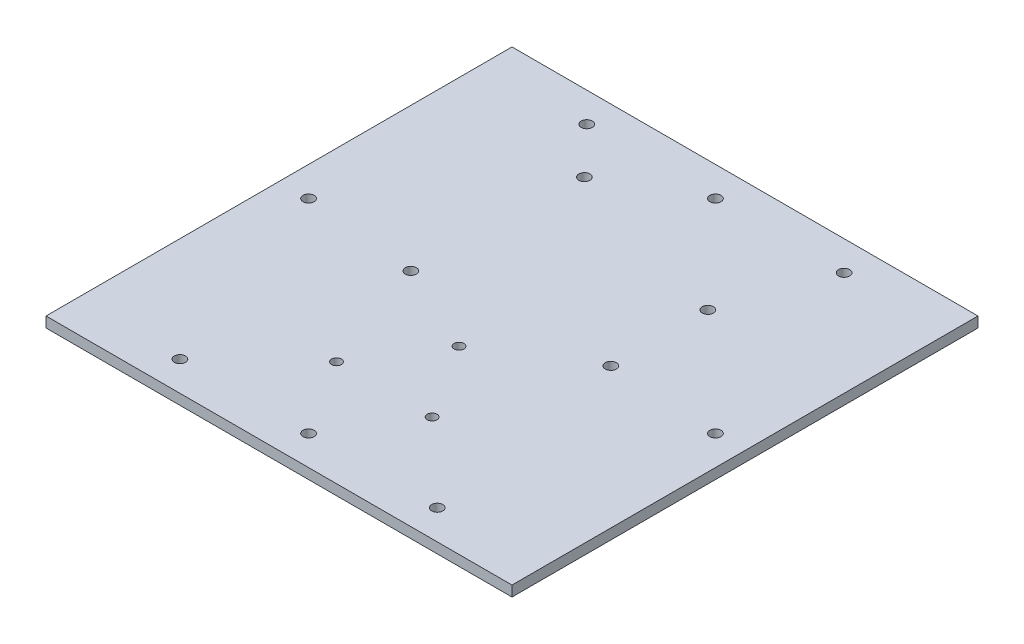
ISO-10303-21;
HEADER;
FILE_DESCRIPTION(('STEP AP214'),'2;1');
FILE_NAME('part.step','',(''),(''),'','','');
FILE_SCHEMA(('AUTOMOTIVE_DESIGN { 1 0 10303 214 1 1 1 1 }'));
ENDSEC;
DATA;
#1=APPLICATION_CONTEXT('core data for automotive mechanical design processes');
#2=APPLICATION_PROTOCOL_DEFINITION('international standard','automotive_design',2000,#1);
#3=PRODUCT_CONTEXT('',#1,'mechanical');
#4=PRODUCT('Part','Part','',(#3));
#5=PRODUCT_RELATED_PRODUCT_CATEGORY('part','',(#4));
#6=PRODUCT_DEFINITION_FORMATION('','',#4);
#7=PRODUCT_DEFINITION_CONTEXT('part definition',#1,'design');
#8=PRODUCT_DEFINITION('design','',#6,#7);
#9=PRODUCT_DEFINITION_SHAPE('','',#8);
#10=(LENGTH_UNIT() NAMED_UNIT(*) SI_UNIT(.MILLI.,.METRE.));
#11=(NAMED_UNIT(*) PLANE_ANGLE_UNIT() SI_UNIT($,.RADIAN.));
#12=(NAMED_UNIT(*) SI_UNIT($,.STERADIAN.) SOLID_ANGLE_UNIT());
#13=UNCERTAINTY_MEASURE_WITH_UNIT(LENGTH_MEASURE(1.E-05),#10,'distance_accuracy_value','');
#14=(GEOMETRIC_REPRESENTATION_CONTEXT(3) GLOBAL_UNCERTAINTY_ASSIGNED_CONTEXT((#13)) GLOBAL_UNIT_ASSIGNED_CONTEXT((#10,
#11,#12)) REPRESENTATION_CONTEXT('',''));
#15=CARTESIAN_POINT('',(0.,0.,0.));
#16=DIRECTION('',(0.,0.,1.));
#17=DIRECTION('',(1.,0.,0.));
#18=AXIS2_PLACEMENT_3D('',#15,#16,#17);
#19=CARTESIAN_POINT('',(67.,3.,0.));
#20=DIRECTION('',(1.,0.,0.));
#21=DIRECTION('',(0.,0.,-1.));
#22=AXIS2_PLACEMENT_3D('',#19,#20,#21);
#23=PLANE('',#22);
#24=DIRECTION('',(0.,0.,1.));
#25=VECTOR('',#24,1.);
#26=CARTESIAN_POINT('',(67.,0.,0.));
#27=LINE('',#26,#25);
#28=CARTESIAN_POINT('',(67.,0.,-67.));
#29=VERTEX_POINT('',#28);
#30=CARTESIAN_POINT('',(67.,0.,67.));
#31=VERTEX_POINT('',#30);
#32=EDGE_CURVE('E176',#29,#31,#27,.T.);
#33=ORIENTED_EDGE('',*,*,#32,.F.);
#34=DIRECTION('',(0.,-1.,0.));
#35=VECTOR('',#34,1.);
#36=CARTESIAN_POINT('',(67.,3.,-67.));
#37=LINE('',#36,#35);
#38=CARTESIAN_POINT('',(67.,3.,-67.));
#39=VERTEX_POINT('',#38);
#40=EDGE_CURVE('E11',#39,#29,#37,.T.);
#41=ORIENTED_EDGE('',*,*,#40,.F.);
#42=DIRECTION('',(0.,0.,1.));
#43=VECTOR('',#42,1.);
#44=CARTESIAN_POINT('',(67.,3.,0.));
#45=LINE('',#44,#43);
#46=CARTESIAN_POINT('',(67.,3.,67.));
#47=VERTEX_POINT('',#46);
#48=EDGE_CURVE('E106',#39,#47,#45,.T.);
#49=ORIENTED_EDGE('',*,*,#48,.T.);
#50=DIRECTION('',(0.,-1.,0.));
#51=VECTOR('',#50,1.);
#52=CARTESIAN_POINT('',(67.,3.,67.));
#53=LINE('',#52,#51);
#54=EDGE_CURVE('E82',#47,#31,#53,.T.);
#55=ORIENTED_EDGE('',*,*,#54,.T.);
#56=EDGE_LOOP('',(#33,#41,#49,#55));
#57=FACE_BOUND('',#56,.T.);
#58=ADVANCED_FACE('F41',(#57),#23,.T.);
#59=CARTESIAN_POINT('',(0.,3.,-66.9999999999999));
#60=DIRECTION('',(0.,0.,-1.));
#61=DIRECTION('',(-1.,0.,0.));
#62=AXIS2_PLACEMENT_3D('',#59,#60,#61);
#63=PLANE('',#62);
#64=DIRECTION('',(1.,0.,0.));
#65=VECTOR('',#64,1.);
#66=CARTESIAN_POINT('',(0.,0.,-66.9999999999999));
#67=LINE('',#66,#65);
#68=CARTESIAN_POINT('',(-67.0000000000002,0.,-66.9999999999999));
#69=VERTEX_POINT('',#68);
#70=EDGE_CURVE('E94',#69,#29,#67,.T.);
#71=ORIENTED_EDGE('',*,*,#70,.F.);
#72=DIRECTION('',(0.,-1.,0.));
#73=VECTOR('',#72,1.);
#74=CARTESIAN_POINT('',(-67.0000000000002,3.,-66.9999999999999));
#75=LINE('',#74,#73);
#76=CARTESIAN_POINT('',(-67.0000000000002,3.,-66.9999999999999));
#77=VERTEX_POINT('',#76);
#78=EDGE_CURVE('E51',#77,#69,#75,.T.);
#79=ORIENTED_EDGE('',*,*,#78,.F.);
#80=DIRECTION('',(1.,0.,0.));
#81=VECTOR('',#80,1.);
#82=CARTESIAN_POINT('',(0.,3.,-66.9999999999999));
#83=LINE('',#82,#81);
#84=EDGE_CURVE('E92',#77,#39,#83,.T.);
#85=ORIENTED_EDGE('',*,*,#84,.T.);
#86=ORIENTED_EDGE('',*,*,#40,.T.);
#87=EDGE_LOOP('',(#71,#79,#85,#86));
#88=FACE_BOUND('',#87,.T.);
#89=ADVANCED_FACE('F90',(#88),#63,.T.);
#90=CARTESIAN_POINT('',(-67.0000000000001,3.,0.));
#91=DIRECTION('',(1.,0.,0.));
#92=DIRECTION('',(0.,0.,-1.));
#93=AXIS2_PLACEMENT_3D('',#90,#91,#92);
#94=PLANE('',#93);
#95=DIRECTION('',(0.,0.,1.));
#96=VECTOR('',#95,1.);
#97=CARTESIAN_POINT('',(-67.0000000000001,0.,0.));
#98=LINE('',#97,#96);
#99=CARTESIAN_POINT('',(-67.,0.,67.));
#100=VERTEX_POINT('',#99);
#101=EDGE_CURVE('E181',#69,#100,#98,.T.);
#102=ORIENTED_EDGE('',*,*,#101,.T.);
#103=DIRECTION('',(0.,-1.,0.));
#104=VECTOR('',#103,1.);
#105=CARTESIAN_POINT('',(-67.,3.,67.));
#106=LINE('',#105,#104);
#107=CARTESIAN_POINT('',(-67.,3.,67.));
#108=VERTEX_POINT('',#107);
#109=EDGE_CURVE('E98',#108,#100,#106,.T.);
#110=ORIENTED_EDGE('',*,*,#109,.F.);
#111=DIRECTION('',(0.,0.,1.));
#112=VECTOR('',#111,1.);
#113=CARTESIAN_POINT('',(-67.0000000000001,3.,0.));
#114=LINE('',#113,#112);
#115=EDGE_CURVE('E100',#77,#108,#114,.T.);
#116=ORIENTED_EDGE('',*,*,#115,.F.);
#117=ORIENTED_EDGE('',*,*,#78,.T.);
#118=EDGE_LOOP('',(#102,#110,#116,#117));
#119=FACE_BOUND('',#118,.T.);
#120=ADVANCED_FACE('F101',(#119),#94,.F.);
#121=CARTESIAN_POINT('',(-13.8303840868332,3.,36.6434533604129));
#122=DIRECTION('',(0.,-1.,0.));
#123=DIRECTION('',(0.,0.,-1.));
#124=AXIS2_PLACEMENT_3D('',#121,#122,#123);
#125=CYLINDRICAL_SURFACE('',#124,1.4);
#126=CARTESIAN_POINT('',(-13.8303840868332,3.,36.6434533604129));
#127=DIRECTION('',(0.,1.,0.));
#128=DIRECTION('',(0.,0.,1.));
#129=AXIS2_PLACEMENT_3D('',#126,#127,#128);
#130=CIRCLE('',#129,1.4);
#131=CARTESIAN_POINT('',(-13.8303840868332,3.,38.0434533604129));
#132=VERTEX_POINT('',#131);
#133=EDGE_CURVE('E136',#132,#132,#130,.T.);
#134=ORIENTED_EDGE('',*,*,#133,.T.);
#135=EDGE_LOOP('',(#134));
#136=FACE_BOUND('',#135,.T.);
#137=CARTESIAN_POINT('',(-13.8303840868332,0.,36.6434533604129));
#138=DIRECTION('',(0.,1.,0.));
#139=DIRECTION('',(0.,0.,1.));
#140=AXIS2_PLACEMENT_3D('',#137,#138,#139);
#141=CIRCLE('',#140,1.4);
#142=CARTESIAN_POINT('',(-13.8303840868332,0.,38.0434533604129));
#143=VERTEX_POINT('',#142);
#144=EDGE_CURVE('E206',#143,#143,#141,.T.);
#145=ORIENTED_EDGE('',*,*,#144,.F.);
#146=EDGE_LOOP('',(#145));
#147=FACE_BOUND('',#146,.T.);
#148=ADVANCED_FACE('F297',(#136,#147),#125,.F.);
#149=CARTESIAN_POINT('',(13.6696159131668,3.,36.6434533604129));
#150=DIRECTION('',(0.,-1.,0.));
#151=DIRECTION('',(0.,0.,-1.));
#152=AXIS2_PLACEMENT_3D('',#149,#150,#151);
#153=CYLINDRICAL_SURFACE('',#152,1.4);
#154=CARTESIAN_POINT('',(13.6696159131668,3.,36.6434533604129));
#155=DIRECTION('',(0.,1.,0.));
#156=DIRECTION('',(0.,0.,1.));
#157=AXIS2_PLACEMENT_3D('',#154,#155,#156);
#158=CIRCLE('',#157,1.4);
#159=CARTESIAN_POINT('',(13.6696159131668,3.,38.0434533604129));
#160=VERTEX_POINT('',#159);
#161=EDGE_CURVE('E132',#160,#160,#158,.T.);
#162=ORIENTED_EDGE('',*,*,#161,.T.);
#163=EDGE_LOOP('',(#162));
#164=FACE_BOUND('',#163,.T.);
#165=CARTESIAN_POINT('',(13.6696159131668,0.,36.6434533604129));
#166=DIRECTION('',(0.,1.,0.));
#167=DIRECTION('',(0.,0.,1.));
#168=AXIS2_PLACEMENT_3D('',#165,#166,#167);
#169=CIRCLE('',#168,1.4);
#170=CARTESIAN_POINT('',(13.6696159131668,0.,38.0434533604129));
#171=VERTEX_POINT('',#170);
#172=EDGE_CURVE('E202',#171,#171,#169,.T.);
#173=ORIENTED_EDGE('',*,*,#172,.F.);
#174=EDGE_LOOP('',(#173));
#175=FACE_BOUND('',#174,.T.);
#176=ADVANCED_FACE('F300',(#164,#175),#153,.F.);
#177=CARTESIAN_POINT('',(-24.1653955822405,3.,-44.9845483771181));
#178=DIRECTION('',(0.,-1.,0.));
#179=DIRECTION('',(0.,0.,-1.));
#180=AXIS2_PLACEMENT_3D('',#177,#178,#179);
#181=CYLINDRICAL_SURFACE('',#180,1.60000000000001);
#182=CARTESIAN_POINT('',(-24.1653955822405,3.,-44.9845483771181));
#183=DIRECTION('',(0.,1.,0.));
#184=DIRECTION('',(0.,0.,1.));
#185=AXIS2_PLACEMENT_3D('',#182,#183,#184);
#186=CIRCLE('',#185,1.60000000000001);
#187=CARTESIAN_POINT('',(-24.1653955822405,3.,-43.384548377118));
#188=VERTEX_POINT('',#187);
#189=EDGE_CURVE('E128',#188,#188,#186,.T.);
#190=ORIENTED_EDGE('',*,*,#189,.T.);
#191=EDGE_LOOP('',(#190));
#192=FACE_BOUND('',#191,.T.);
#193=CARTESIAN_POINT('',(-24.1653955822405,0.,-44.9845483771181));
#194=DIRECTION('',(0.,1.,0.));
#195=DIRECTION('',(0.,0.,1.));
#196=AXIS2_PLACEMENT_3D('',#193,#194,#195);
#197=CIRCLE('',#196,1.60000000000001);
#198=CARTESIAN_POINT('',(-24.1653955822405,0.,-43.384548377118));
#199=VERTEX_POINT('',#198);
#200=EDGE_CURVE('E198',#199,#199,#197,.T.);
#201=ORIENTED_EDGE('',*,*,#200,.F.);
#202=EDGE_LOOP('',(#201));
#203=FACE_BOUND('',#202,.T.);
#204=ADVANCED_FACE('F304',(#192,#203),#181,.F.);
#205=CARTESIAN_POINT('',(26.6346044177595,3.,-29.6845483771181));
#206=DIRECTION('',(0.,-1.,0.));
#207=DIRECTION('',(0.,0.,-1.));
#208=AXIS2_PLACEMENT_3D('',#205,#206,#207);
#209=CYLINDRICAL_SURFACE('',#208,1.60000000000002);
#210=CARTESIAN_POINT('',(26.6346044177595,3.,-29.6845483771181));
#211=DIRECTION('',(0.,1.,0.));
#212=DIRECTION('',(0.,0.,1.));
#213=AXIS2_PLACEMENT_3D('',#210,#211,#212);
#214=CIRCLE('',#213,1.60000000000002);
#215=CARTESIAN_POINT('',(26.6346044177595,3.,-28.0845483771181));
#216=VERTEX_POINT('',#215);
#217=EDGE_CURVE('E124',#216,#216,#214,.T.);
#218=ORIENTED_EDGE('',*,*,#217,.T.);
#219=EDGE_LOOP('',(#218));
#220=FACE_BOUND('',#219,.T.);
#221=CARTESIAN_POINT('',(26.6346044177595,0.,-29.6845483771181));
#222=DIRECTION('',(0.,1.,0.));
#223=DIRECTION('',(0.,0.,1.));
#224=AXIS2_PLACEMENT_3D('',#221,#222,#223);
#225=CIRCLE('',#224,1.60000000000002);
#226=CARTESIAN_POINT('',(26.6346044177595,0.,-28.0845483771181));
#227=VERTEX_POINT('',#226);
#228=EDGE_CURVE('E194',#227,#227,#225,.T.);
#229=ORIENTED_EDGE('',*,*,#228,.F.);
#230=EDGE_LOOP('',(#229));
#231=FACE_BOUND('',#230,.T.);
#232=ADVANCED_FACE('F308',(#220,#231),#209,.F.);
#233=CARTESIAN_POINT('',(-25.7653955822406,3.,3.31545162288194));
#234=DIRECTION('',(0.,-1.,0.));
#235=DIRECTION('',(0.,0.,-1.));
#236=AXIS2_PLACEMENT_3D('',#233,#234,#235);
#237=CYLINDRICAL_SURFACE('',#236,1.60000000000001);
#238=CARTESIAN_POINT('',(-25.7653955822406,3.,3.31545162288194));
#239=DIRECTION('',(0.,1.,0.));
#240=DIRECTION('',(0.,0.,1.));
#241=AXIS2_PLACEMENT_3D('',#238,#239,#240);
#242=CIRCLE('',#241,1.60000000000001);
#243=CARTESIAN_POINT('',(-25.7653955822406,3.,4.91545162288194));
#244=VERTEX_POINT('',#243);
#245=EDGE_CURVE('E120',#244,#244,#242,.T.);
#246=ORIENTED_EDGE('',*,*,#245,.T.);
#247=EDGE_LOOP('',(#246));
#248=FACE_BOUND('',#247,.T.);
#249=CARTESIAN_POINT('',(-25.7653955822406,0.,3.31545162288194));
#250=DIRECTION('',(0.,1.,0.));
#251=DIRECTION('',(0.,0.,1.));
#252=AXIS2_PLACEMENT_3D('',#249,#250,#251);
#253=CIRCLE('',#252,1.60000000000001);
#254=CARTESIAN_POINT('',(-25.7653955822406,0.,4.91545162288194));
#255=VERTEX_POINT('',#254);
#256=EDGE_CURVE('E190',#255,#255,#253,.T.);
#257=ORIENTED_EDGE('',*,*,#256,.F.);
#258=EDGE_LOOP('',(#257));
#259=FACE_BOUND('',#258,.T.);
#260=ADVANCED_FACE('F312',(#248,#259),#237,.F.);
#261=CARTESIAN_POINT('',(26.6346044177595,3.,-1.78454837711807));
#262=DIRECTION('',(0.,-1.,0.));
#263=DIRECTION('',(0.,0.,-1.));
#264=AXIS2_PLACEMENT_3D('',#261,#262,#263);
#265=CYLINDRICAL_SURFACE('',#264,1.60000000000002);
#266=CARTESIAN_POINT('',(26.6346044177595,3.,-1.78454837711807));
#267=DIRECTION('',(0.,1.,0.));
#268=DIRECTION('',(0.,0.,1.));
#269=AXIS2_PLACEMENT_3D('',#266,#267,#268);
#270=CIRCLE('',#269,1.60000000000002);
#271=CARTESIAN_POINT('',(26.6346044177595,3.,-0.184548377118048));
#272=VERTEX_POINT('',#271);
#273=EDGE_CURVE('E116',#272,#272,#270,.T.);
#274=ORIENTED_EDGE('',*,*,#273,.T.);
#275=EDGE_LOOP('',(#274));
#276=FACE_BOUND('',#275,.T.);
#277=CARTESIAN_POINT('',(26.6346044177595,0.,-1.78454837711807));
#278=DIRECTION('',(0.,1.,0.));
#279=DIRECTION('',(0.,0.,1.));
#280=AXIS2_PLACEMENT_3D('',#277,#278,#279);
#281=CIRCLE('',#280,1.60000000000002);
#282=CARTESIAN_POINT('',(26.6346044177595,0.,-0.184548377118048));
#283=VERTEX_POINT('',#282);
#284=EDGE_CURVE('E186',#283,#283,#281,.T.);
#285=ORIENTED_EDGE('',*,*,#284,.F.);
#286=EDGE_LOOP('',(#285));
#287=FACE_BOUND('',#286,.T.);
#288=ADVANCED_FACE('F316',(#276,#287),#265,.F.);
#289=CARTESIAN_POINT('',(0.,3.,67.));
#290=DIRECTION('',(0.,0.,-1.));
#291=DIRECTION('',(-1.,0.,0.));
#292=AXIS2_PLACEMENT_3D('',#289,#290,#291);
#293=PLANE('',#292);
#294=DIRECTION('',(1.,0.,0.));
#295=VECTOR('',#294,1.);
#296=CARTESIAN_POINT('',(0.,0.,67.));
#297=LINE('',#296,#295);
#298=EDGE_CURVE('E75',#100,#31,#297,.T.);
#299=ORIENTED_EDGE('',*,*,#298,.T.);
#300=ORIENTED_EDGE('',*,*,#54,.F.);
#301=DIRECTION('',(1.,0.,0.));
#302=VECTOR('',#301,1.);
#303=CARTESIAN_POINT('',(0.,3.,67.));
#304=LINE('',#303,#302);
#305=EDGE_CURVE('E59',#108,#47,#304,.T.);
#306=ORIENTED_EDGE('',*,*,#305,.F.);
#307=ORIENTED_EDGE('',*,*,#109,.T.);
#308=EDGE_LOOP('',(#299,#300,#306,#307));
#309=FACE_BOUND('',#308,.T.);
#310=ADVANCED_FACE('F219',(#309),#293,.F.);
#311=CARTESIAN_POINT('',(0.,3.,-58.4999999999999));
#312=DIRECTION('',(0.,-1.,0.));
#313=DIRECTION('',(0.,0.,-1.));
#314=AXIS2_PLACEMENT_3D('',#311,#312,#313);
#315=CYLINDRICAL_SURFACE('',#314,1.60000000000002);
#316=CARTESIAN_POINT('',(0.,3.,-58.4999999999999));
#317=DIRECTION('',(0.,1.,0.));
#318=DIRECTION('',(0.,0.,1.));
#319=AXIS2_PLACEMENT_3D('',#316,#317,#318);
#320=CIRCLE('',#319,1.60000000000002);
#321=CARTESIAN_POINT('',(0.,3.,-56.8999999999999));
#322=VERTEX_POINT('',#321);
#323=EDGE_CURVE('E110',#322,#322,#320,.T.);
#324=ORIENTED_EDGE('',*,*,#323,.T.);
#325=EDGE_LOOP('',(#324));
#326=FACE_BOUND('',#325,.T.);
#327=CARTESIAN_POINT('',(0.,0.,-58.4999999999999));
#328=DIRECTION('',(0.,1.,0.));
#329=DIRECTION('',(0.,0.,1.));
#330=AXIS2_PLACEMENT_3D('',#327,#328,#329);
#331=CIRCLE('',#330,1.60000000000002);
#332=CARTESIAN_POINT('',(0.,0.,-56.8999999999999));
#333=VERTEX_POINT('',#332);
#334=EDGE_CURVE('E172',#333,#333,#331,.T.);
#335=ORIENTED_EDGE('',*,*,#334,.F.);
#336=EDGE_LOOP('',(#335));
#337=FACE_BOUND('',#336,.T.);
#338=ADVANCED_FACE('F230',(#326,#337),#315,.F.);
#339=CARTESIAN_POINT('',(-58.5,3.,0.));
#340=DIRECTION('',(0.,-1.,0.));
#341=DIRECTION('',(0.,0.,-1.));
#342=AXIS2_PLACEMENT_3D('',#339,#340,#341);
#343=CYLINDRICAL_SURFACE('',#342,1.60000000000002);
#344=CARTESIAN_POINT('',(-58.5,3.,0.));
#345=DIRECTION('',(0.,1.,0.));
#346=DIRECTION('',(0.,0.,1.));
#347=AXIS2_PLACEMENT_3D('',#344,#345,#346);
#348=CIRCLE('',#347,1.60000000000002);
#349=CARTESIAN_POINT('',(-58.5,3.,1.60000000000008));
#350=VERTEX_POINT('',#349);
#351=EDGE_CURVE('E525',#350,#350,#348,.T.);
#352=ORIENTED_EDGE('',*,*,#351,.T.);
#353=EDGE_LOOP('',(#352));
#354=FACE_BOUND('',#353,.T.);
#355=CARTESIAN_POINT('',(-58.5,0.,0.));
#356=DIRECTION('',(0.,1.,0.));
#357=DIRECTION('',(0.,0.,1.));
#358=AXIS2_PLACEMENT_3D('',#355,#356,#357);
#359=CIRCLE('',#358,1.60000000000002);
#360=CARTESIAN_POINT('',(-58.5,0.,1.60000000000008));
#361=VERTEX_POINT('',#360);
#362=EDGE_CURVE('E168',#361,#361,#359,.T.);
#363=ORIENTED_EDGE('',*,*,#362,.F.);
#364=EDGE_LOOP('',(#363));
#365=FACE_BOUND('',#364,.T.);
#366=ADVANCED_FACE('F233',(#354,#365),#343,.F.);
#367=CARTESIAN_POINT('',(0.,3.,58.5));
#368=DIRECTION('',(0.,-1.,0.));
#369=DIRECTION('',(0.,0.,-1.));
#370=AXIS2_PLACEMENT_3D('',#367,#368,#369);
#371=CYLINDRICAL_SURFACE('',#370,1.60000000000002);
#372=CARTESIAN_POINT('',(0.,3.,58.5));
#373=DIRECTION('',(0.,1.,0.));
#374=DIRECTION('',(0.,0.,1.));
#375=AXIS2_PLACEMENT_3D('',#372,#373,#374);
#376=CIRCLE('',#375,1.60000000000002);
#377=CARTESIAN_POINT('',(0.,3.,60.1));
#378=VERTEX_POINT('',#377);
#379=EDGE_CURVE('E521',#378,#378,#376,.T.);
#380=ORIENTED_EDGE('',*,*,#379,.T.);
#381=EDGE_LOOP('',(#380));
#382=FACE_BOUND('',#381,.T.);
#383=CARTESIAN_POINT('',(0.,0.,58.5));
#384=DIRECTION('',(0.,1.,0.));
#385=DIRECTION('',(0.,0.,1.));
#386=AXIS2_PLACEMENT_3D('',#383,#384,#385);
#387=CIRCLE('',#386,1.60000000000002);
#388=CARTESIAN_POINT('',(0.,0.,60.1));
#389=VERTEX_POINT('',#388);
#390=EDGE_CURVE('E164',#389,#389,#387,.T.);
#391=ORIENTED_EDGE('',*,*,#390,.F.);
#392=EDGE_LOOP('',(#391));
#393=FACE_BOUND('',#392,.T.);
#394=ADVANCED_FACE('F237',(#382,#393),#371,.F.);
#395=CARTESIAN_POINT('',(58.5,3.,0.));
#396=DIRECTION('',(0.,-1.,0.));
#397=DIRECTION('',(0.,0.,-1.));
#398=AXIS2_PLACEMENT_3D('',#395,#396,#397);
#399=CYLINDRICAL_SURFACE('',#398,1.60000000000002);
#400=CARTESIAN_POINT('',(58.5,3.,0.));
#401=DIRECTION('',(0.,1.,0.));
#402=DIRECTION('',(0.,0.,1.));
#403=AXIS2_PLACEMENT_3D('',#400,#401,#402);
#404=CIRCLE('',#403,1.60000000000002);
#405=CARTESIAN_POINT('',(58.5,3.,1.60000000000009));
#406=VERTEX_POINT('',#405);
#407=EDGE_CURVE('E517',#406,#406,#404,.T.);
#408=ORIENTED_EDGE('',*,*,#407,.T.);
#409=EDGE_LOOP('',(#408));
#410=FACE_BOUND('',#409,.T.);
#411=CARTESIAN_POINT('',(58.5,0.,0.));
#412=DIRECTION('',(0.,1.,0.));
#413=DIRECTION('',(0.,0.,1.));
#414=AXIS2_PLACEMENT_3D('',#411,#412,#413);
#415=CIRCLE('',#414,1.60000000000002);
#416=CARTESIAN_POINT('',(58.5,0.,1.60000000000009));
#417=VERTEX_POINT('',#416);
#418=EDGE_CURVE('E160',#417,#417,#415,.T.);
#419=ORIENTED_EDGE('',*,*,#418,.F.);
#420=EDGE_LOOP('',(#419));
#421=FACE_BOUND('',#420,.T.);
#422=ADVANCED_FACE('F241',(#410,#421),#399,.F.);
#423=CARTESIAN_POINT('',(-37.,3.,-58.4999999999999));
#424=DIRECTION('',(0.,-1.,0.));
#425=DIRECTION('',(0.,0.,-1.));
#426=AXIS2_PLACEMENT_3D('',#423,#424,#425);
#427=CYLINDRICAL_SURFACE('',#426,1.60000000000002);
#428=CARTESIAN_POINT('',(-37.,3.,-58.4999999999999));
#429=DIRECTION('',(0.,1.,0.));
#430=DIRECTION('',(0.,0.,1.));
#431=AXIS2_PLACEMENT_3D('',#428,#429,#430);
#432=CIRCLE('',#431,1.60000000000002);
#433=CARTESIAN_POINT('',(-37.,3.,-56.8999999999999));
#434=VERTEX_POINT('',#433);
#435=EDGE_CURVE('E513',#434,#434,#432,.T.);
#436=ORIENTED_EDGE('',*,*,#435,.T.);
#437=EDGE_LOOP('',(#436));
#438=FACE_BOUND('',#437,.T.);
#439=CARTESIAN_POINT('',(-37.,0.,-58.4999999999999));
#440=DIRECTION('',(0.,1.,0.));
#441=DIRECTION('',(0.,0.,1.));
#442=AXIS2_PLACEMENT_3D('',#439,#440,#441);
#443=CIRCLE('',#442,1.60000000000002);
#444=CARTESIAN_POINT('',(-37.,0.,-56.8999999999999));
#445=VERTEX_POINT('',#444);
#446=EDGE_CURVE('E156',#445,#445,#443,.T.);
#447=ORIENTED_EDGE('',*,*,#446,.F.);
#448=EDGE_LOOP('',(#447));
#449=FACE_BOUND('',#448,.T.);
#450=ADVANCED_FACE('F245',(#438,#449),#427,.F.);
#451=CARTESIAN_POINT('',(36.9999999999999,3.,-58.4999999999999));
#452=DIRECTION('',(0.,-1.,0.));
#453=DIRECTION('',(0.,0.,-1.));
#454=AXIS2_PLACEMENT_3D('',#451,#452,#453);
#455=CYLINDRICAL_SURFACE('',#454,1.60000000000002);
#456=CARTESIAN_POINT('',(36.9999999999999,3.,-58.4999999999999));
#457=DIRECTION('',(0.,1.,0.));
#458=DIRECTION('',(0.,0.,1.));
#459=AXIS2_PLACEMENT_3D('',#456,#457,#458);
#460=CIRCLE('',#459,1.60000000000002);
#461=CARTESIAN_POINT('',(36.9999999999999,3.,-56.8999999999999));
#462=VERTEX_POINT('',#461);
#463=EDGE_CURVE('E509',#462,#462,#460,.T.);
#464=ORIENTED_EDGE('',*,*,#463,.T.);
#465=EDGE_LOOP('',(#464));
#466=FACE_BOUND('',#465,.T.);
#467=CARTESIAN_POINT('',(36.9999999999999,0.,-58.4999999999999));
#468=DIRECTION('',(0.,1.,0.));
#469=DIRECTION('',(0.,0.,1.));
#470=AXIS2_PLACEMENT_3D('',#467,#468,#469);
#471=CIRCLE('',#470,1.60000000000002);
#472=CARTESIAN_POINT('',(36.9999999999999,0.,-56.8999999999999));
#473=VERTEX_POINT('',#472);
#474=EDGE_CURVE('E152',#473,#473,#471,.T.);
#475=ORIENTED_EDGE('',*,*,#474,.F.);
#476=EDGE_LOOP('',(#475));
#477=FACE_BOUND('',#476,.T.);
#478=ADVANCED_FACE('F249',(#466,#477),#455,.F.);
#479=CARTESIAN_POINT('',(-37.,3.,58.5));
#480=DIRECTION('',(0.,-1.,0.));
#481=DIRECTION('',(0.,0.,-1.));
#482=AXIS2_PLACEMENT_3D('',#479,#480,#481);
#483=CYLINDRICAL_SURFACE('',#482,1.60000000000002);
#484=CARTESIAN_POINT('',(-37.,3.,58.5));
#485=DIRECTION('',(0.,1.,0.));
#486=DIRECTION('',(0.,0.,1.));
#487=AXIS2_PLACEMENT_3D('',#484,#485,#486);
#488=CIRCLE('',#487,1.60000000000002);
#489=CARTESIAN_POINT('',(-37.,3.,60.1));
#490=VERTEX_POINT('',#489);
#491=EDGE_CURVE('E264',#490,#490,#488,.T.);
#492=ORIENTED_EDGE('',*,*,#491,.T.);
#493=EDGE_LOOP('',(#492));
#494=FACE_BOUND('',#493,.T.);
#495=CARTESIAN_POINT('',(-37.,0.,58.5));
#496=DIRECTION('',(0.,1.,0.));
#497=DIRECTION('',(0.,0.,1.));
#498=AXIS2_PLACEMENT_3D('',#495,#496,#497);
#499=CIRCLE('',#498,1.60000000000002);
#500=CARTESIAN_POINT('',(-37.,0.,60.1));
#501=VERTEX_POINT('',#500);
#502=EDGE_CURVE('E148',#501,#501,#499,.T.);
#503=ORIENTED_EDGE('',*,*,#502,.F.);
#504=EDGE_LOOP('',(#503));
#505=FACE_BOUND('',#504,.T.);
#506=ADVANCED_FACE('F252',(#494,#505),#483,.F.);
#507=CARTESIAN_POINT('',(36.9999999999999,3.,58.5));
#508=DIRECTION('',(0.,-1.,0.));
#509=DIRECTION('',(0.,0.,-1.));
#510=AXIS2_PLACEMENT_3D('',#507,#508,#509);
#511=CYLINDRICAL_SURFACE('',#510,1.60000000000002);
#512=CARTESIAN_POINT('',(36.9999999999999,3.,58.5));
#513=DIRECTION('',(0.,1.,0.));
#514=DIRECTION('',(0.,0.,1.));
#515=AXIS2_PLACEMENT_3D('',#512,#513,#514);
#516=CIRCLE('',#515,1.60000000000002);
#517=CARTESIAN_POINT('',(36.9999999999999,3.,60.1));
#518=VERTEX_POINT('',#517);
#519=EDGE_CURVE('E214',#518,#518,#516,.T.);
#520=ORIENTED_EDGE('',*,*,#519,.T.);
#521=EDGE_LOOP('',(#520));
#522=FACE_BOUND('',#521,.T.);
#523=CARTESIAN_POINT('',(36.9999999999999,0.,58.5));
#524=DIRECTION('',(0.,1.,0.));
#525=DIRECTION('',(0.,0.,1.));
#526=AXIS2_PLACEMENT_3D('',#523,#524,#525);
#527=CIRCLE('',#526,1.60000000000002);
#528=CARTESIAN_POINT('',(36.9999999999999,0.,60.1));
#529=VERTEX_POINT('',#528);
#530=EDGE_CURVE('E144',#529,#529,#527,.T.);
#531=ORIENTED_EDGE('',*,*,#530,.F.);
#532=EDGE_LOOP('',(#531));
#533=FACE_BOUND('',#532,.T.);
#534=ADVANCED_FACE('F43',(#522,#533),#511,.F.);
#535=CARTESIAN_POINT('',(-0.0803840868331803,3.,15.1434533604129));
#536=DIRECTION('',(0.,-1.,0.));
#537=DIRECTION('',(0.,0.,-1.));
#538=AXIS2_PLACEMENT_3D('',#535,#536,#537);
#539=CYLINDRICAL_SURFACE('',#538,1.4);
#540=CARTESIAN_POINT('',(-0.0803840868331803,3.,15.1434533604129));
#541=DIRECTION('',(0.,1.,0.));
#542=DIRECTION('',(0.,0.,1.));
#543=AXIS2_PLACEMENT_3D('',#540,#541,#542);
#544=CIRCLE('',#543,1.4);
#545=CARTESIAN_POINT('',(-0.0803840868331803,3.,16.5434533604129));
#546=VERTEX_POINT('',#545);
#547=EDGE_CURVE('E140',#546,#546,#544,.T.);
#548=ORIENTED_EDGE('',*,*,#547,.T.);
#549=EDGE_LOOP('',(#548));
#550=FACE_BOUND('',#549,.T.);
#551=CARTESIAN_POINT('',(-0.0803840868331803,0.,15.1434533604129));
#552=DIRECTION('',(0.,1.,0.));
#553=DIRECTION('',(0.,0.,1.));
#554=AXIS2_PLACEMENT_3D('',#551,#552,#553);
#555=CIRCLE('',#554,1.4);
#556=CARTESIAN_POINT('',(-0.0803840868331803,0.,16.5434533604129));
#557=VERTEX_POINT('',#556);
#558=EDGE_CURVE('E210',#557,#557,#555,.T.);
#559=ORIENTED_EDGE('',*,*,#558,.F.);
#560=EDGE_LOOP('',(#559));
#561=FACE_BOUND('',#560,.T.);
#562=ADVANCED_FACE('F259',(#550,#561),#539,.F.);
#563=CARTESIAN_POINT('',(0.,3.,0.));
#564=DIRECTION('',(0.,1.,0.));
#565=DIRECTION('',(0.,0.,1.));
#566=AXIS2_PLACEMENT_3D('',#563,#564,#565);
#567=PLANE('',#566);
#568=ORIENTED_EDGE('',*,*,#519,.F.);
#569=EDGE_LOOP('',(#568));
#570=FACE_BOUND('',#569,.T.);
#571=ORIENTED_EDGE('',*,*,#491,.F.);
#572=EDGE_LOOP('',(#571));
#573=FACE_BOUND('',#572,.T.);
#574=ORIENTED_EDGE('',*,*,#463,.F.);
#575=EDGE_LOOP('',(#574));
#576=FACE_BOUND('',#575,.T.);
#577=ORIENTED_EDGE('',*,*,#435,.F.);
#578=EDGE_LOOP('',(#577));
#579=FACE_BOUND('',#578,.T.);
#580=ORIENTED_EDGE('',*,*,#407,.F.);
#581=EDGE_LOOP('',(#580));
#582=FACE_BOUND('',#581,.T.);
#583=ORIENTED_EDGE('',*,*,#379,.F.);
#584=EDGE_LOOP('',(#583));
#585=FACE_BOUND('',#584,.T.);
#586=ORIENTED_EDGE('',*,*,#351,.F.);
#587=EDGE_LOOP('',(#586));
#588=FACE_BOUND('',#587,.T.);
#589=ORIENTED_EDGE('',*,*,#323,.F.);
#590=EDGE_LOOP('',(#589));
#591=FACE_BOUND('',#590,.T.);
#592=ORIENTED_EDGE('',*,*,#48,.F.);
#593=ORIENTED_EDGE('',*,*,#84,.F.);
#594=ORIENTED_EDGE('',*,*,#115,.T.);
#595=ORIENTED_EDGE('',*,*,#305,.T.);
#596=EDGE_LOOP('',(#592,#593,#594,#595));
#597=FACE_BOUND('',#596,.T.);
#598=ORIENTED_EDGE('',*,*,#273,.F.);
#599=EDGE_LOOP('',(#598));
#600=FACE_BOUND('',#599,.T.);
#601=ORIENTED_EDGE('',*,*,#245,.F.);
#602=EDGE_LOOP('',(#601));
#603=FACE_BOUND('',#602,.T.);
#604=ORIENTED_EDGE('',*,*,#217,.F.);
#605=EDGE_LOOP('',(#604));
#606=FACE_BOUND('',#605,.T.);
#607=ORIENTED_EDGE('',*,*,#189,.F.);
#608=EDGE_LOOP('',(#607));
#609=FACE_BOUND('',#608,.T.);
#610=ORIENTED_EDGE('',*,*,#161,.F.);
#611=EDGE_LOOP('',(#610));
#612=FACE_BOUND('',#611,.T.);
#613=ORIENTED_EDGE('',*,*,#133,.F.);
#614=EDGE_LOOP('',(#613));
#615=FACE_BOUND('',#614,.T.);
#616=ORIENTED_EDGE('',*,*,#547,.F.);
#617=EDGE_LOOP('',(#616));
#618=FACE_BOUND('',#617,.T.);
#619=ADVANCED_FACE('F104',(#570,#573,#576,#579,#582,#585,#588,#591,#597,#600,#603,#606,#609,
#612,#615,#618),#567,.T.);
#620=CARTESIAN_POINT('',(0.,0.,0.));
#621=DIRECTION('',(0.,1.,0.));
#622=DIRECTION('',(0.,0.,1.));
#623=AXIS2_PLACEMENT_3D('',#620,#621,#622);
#624=PLANE('',#623);
#625=ORIENTED_EDGE('',*,*,#530,.T.);
#626=EDGE_LOOP('',(#625));
#627=FACE_BOUND('',#626,.T.);
#628=ORIENTED_EDGE('',*,*,#502,.T.);
#629=EDGE_LOOP('',(#628));
#630=FACE_BOUND('',#629,.T.);
#631=ORIENTED_EDGE('',*,*,#474,.T.);
#632=EDGE_LOOP('',(#631));
#633=FACE_BOUND('',#632,.T.);
#634=ORIENTED_EDGE('',*,*,#446,.T.);
#635=EDGE_LOOP('',(#634));
#636=FACE_BOUND('',#635,.T.);
#637=ORIENTED_EDGE('',*,*,#418,.T.);
#638=EDGE_LOOP('',(#637));
#639=FACE_BOUND('',#638,.T.);
#640=ORIENTED_EDGE('',*,*,#390,.T.);
#641=EDGE_LOOP('',(#640));
#642=FACE_BOUND('',#641,.T.);
#643=ORIENTED_EDGE('',*,*,#362,.T.);
#644=EDGE_LOOP('',(#643));
#645=FACE_BOUND('',#644,.T.);
#646=ORIENTED_EDGE('',*,*,#334,.T.);
#647=EDGE_LOOP('',(#646));
#648=FACE_BOUND('',#647,.T.);
#649=ORIENTED_EDGE('',*,*,#32,.T.);
#650=ORIENTED_EDGE('',*,*,#298,.F.);
#651=ORIENTED_EDGE('',*,*,#101,.F.);
#652=ORIENTED_EDGE('',*,*,#70,.T.);
#653=EDGE_LOOP('',(#649,#650,#651,#652));
#654=FACE_BOUND('',#653,.T.);
#655=ORIENTED_EDGE('',*,*,#284,.T.);
#656=EDGE_LOOP('',(#655));
#657=FACE_BOUND('',#656,.T.);
#658=ORIENTED_EDGE('',*,*,#256,.T.);
#659=EDGE_LOOP('',(#658));
#660=FACE_BOUND('',#659,.T.);
#661=ORIENTED_EDGE('',*,*,#228,.T.);
#662=EDGE_LOOP('',(#661));
#663=FACE_BOUND('',#662,.T.);
#664=ORIENTED_EDGE('',*,*,#200,.T.);
#665=EDGE_LOOP('',(#664));
#666=FACE_BOUND('',#665,.T.);
#667=ORIENTED_EDGE('',*,*,#172,.T.);
#668=EDGE_LOOP('',(#667));
#669=FACE_BOUND('',#668,.T.);
#670=ORIENTED_EDGE('',*,*,#144,.T.);
#671=EDGE_LOOP('',(#670));
#672=FACE_BOUND('',#671,.T.);
#673=ORIENTED_EDGE('',*,*,#558,.T.);
#674=EDGE_LOOP('',(#673));
#675=FACE_BOUND('',#674,.T.);
#676=ADVANCED_FACE('F220',(#627,#630,#633,#636,#639,#642,#645,#648,#654,#657,#660,#663,#666,
#669,#672,#675),#624,.F.);
#677=CLOSED_SHELL('',(#58,#89,#120,#148,#176,#204,#232,#260,#288,#310,#338,#366,#394,#422,#450,
#478,#506,#534,#562,#619,#676));
#678=MANIFOLD_SOLID_BREP('B2',#677);
#679=ADVANCED_BREP_SHAPE_REPRESENTATION('',(#18,#678),#14);
#680=SHAPE_DEFINITION_REPRESENTATION(#9,#679);
ENDSEC;
END-ISO-10303-21;
